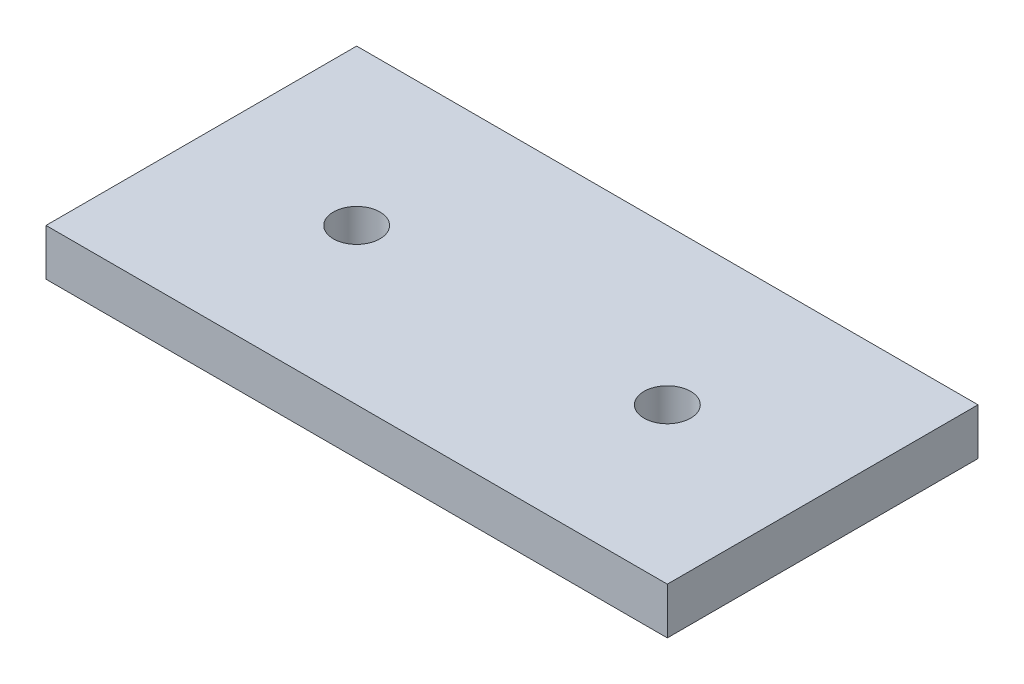
ISO-10303-21;
HEADER;
FILE_DESCRIPTION(('STEP AP214'),'2;1');
FILE_NAME('part.step','',(''),(''),'','','');
FILE_SCHEMA(('AUTOMOTIVE_DESIGN { 1 0 10303 214 1 1 1 1 }'));
ENDSEC;
DATA;
#1=APPLICATION_CONTEXT('core data for automotive mechanical design processes');
#2=APPLICATION_PROTOCOL_DEFINITION('international standard','automotive_design',2000,#1);
#3=PRODUCT_CONTEXT('',#1,'mechanical');
#4=PRODUCT('Part','Part','',(#3));
#5=PRODUCT_RELATED_PRODUCT_CATEGORY('part','',(#4));
#6=PRODUCT_DEFINITION_FORMATION('','',#4);
#7=PRODUCT_DEFINITION_CONTEXT('part definition',#1,'design');
#8=PRODUCT_DEFINITION('design','',#6,#7);
#9=PRODUCT_DEFINITION_SHAPE('','',#8);
#10=(LENGTH_UNIT() NAMED_UNIT(*) SI_UNIT(.MILLI.,.METRE.));
#11=(NAMED_UNIT(*) PLANE_ANGLE_UNIT() SI_UNIT($,.RADIAN.));
#12=(NAMED_UNIT(*) SI_UNIT($,.STERADIAN.) SOLID_ANGLE_UNIT());
#13=UNCERTAINTY_MEASURE_WITH_UNIT(LENGTH_MEASURE(1.E-05),#10,'distance_accuracy_value','');
#14=(GEOMETRIC_REPRESENTATION_CONTEXT(3) GLOBAL_UNCERTAINTY_ASSIGNED_CONTEXT((#13)) GLOBAL_UNIT_ASSIGNED_CONTEXT((#10,
#11,#12)) REPRESENTATION_CONTEXT('',''));
#15=CARTESIAN_POINT('',(0.,0.,0.));
#16=DIRECTION('',(0.,0.,1.));
#17=DIRECTION('',(1.,0.,0.));
#18=AXIS2_PLACEMENT_3D('',#15,#16,#17);
#19=CARTESIAN_POINT('',(0.,3.,0.));
#20=DIRECTION('',(0.,1.,0.));
#21=DIRECTION('',(0.,0.,1.));
#22=AXIS2_PLACEMENT_3D('',#19,#20,#21);
#23=PLANE('',#22);
#24=CARTESIAN_POINT('',(-10.,3.,0.));
#25=DIRECTION('',(0.,1.,0.));
#26=DIRECTION('',(0.,0.,1.));
#27=AXIS2_PLACEMENT_3D('',#24,#25,#26);
#28=CIRCLE('',#27,1.5);
#29=CARTESIAN_POINT('',(-10.,3.,1.5));
#30=VERTEX_POINT('',#29);
#31=EDGE_CURVE('E102',#30,#30,#28,.T.);
#32=ORIENTED_EDGE('',*,*,#31,.F.);
#33=EDGE_LOOP('',(#32));
#34=FACE_BOUND('',#33,.T.);
#35=DIRECTION('',(0.,0.,-1.));
#36=VECTOR('',#35,1.);
#37=CARTESIAN_POINT('',(20.,3.,-10.));
#38=LINE('',#37,#36);
#39=CARTESIAN_POINT('',(20.,3.,10.));
#40=VERTEX_POINT('',#39);
#41=CARTESIAN_POINT('',(20.,3.,-10.));
#42=VERTEX_POINT('',#41);
#43=EDGE_CURVE('E87',#40,#42,#38,.T.);
#44=ORIENTED_EDGE('',*,*,#43,.T.);
#45=DIRECTION('',(-1.,0.,0.));
#46=VECTOR('',#45,1.);
#47=CARTESIAN_POINT('',(-20.,3.,-10.));
#48=LINE('',#47,#46);
#49=CARTESIAN_POINT('',(-20.,3.,-10.));
#50=VERTEX_POINT('',#49);
#51=EDGE_CURVE('E82',#42,#50,#48,.T.);
#52=ORIENTED_EDGE('',*,*,#51,.T.);
#53=DIRECTION('',(0.,0.,1.));
#54=VECTOR('',#53,1.);
#55=CARTESIAN_POINT('',(-20.,3.,-10.));
#56=LINE('',#55,#54);
#57=CARTESIAN_POINT('',(-20.,3.,10.));
#58=VERTEX_POINT('',#57);
#59=EDGE_CURVE('E85',#50,#58,#56,.T.);
#60=ORIENTED_EDGE('',*,*,#59,.T.);
#61=DIRECTION('',(1.,0.,0.));
#62=VECTOR('',#61,1.);
#63=CARTESIAN_POINT('',(-20.,3.,10.));
#64=LINE('',#63,#62);
#65=EDGE_CURVE('E52',#58,#40,#64,.T.);
#66=ORIENTED_EDGE('',*,*,#65,.T.);
#67=EDGE_LOOP('',(#44,#52,#60,#66));
#68=FACE_BOUND('',#67,.T.);
#69=CARTESIAN_POINT('',(10.,3.,0.));
#70=DIRECTION('',(0.,1.,0.));
#71=DIRECTION('',(0.,0.,1.));
#72=AXIS2_PLACEMENT_3D('',#69,#70,#71);
#73=CIRCLE('',#72,1.5);
#74=CARTESIAN_POINT('',(10.,3.,1.5));
#75=VERTEX_POINT('',#74);
#76=EDGE_CURVE('E117',#75,#75,#73,.T.);
#77=ORIENTED_EDGE('',*,*,#76,.F.);
#78=EDGE_LOOP('',(#77));
#79=FACE_BOUND('',#78,.T.);
#80=ADVANCED_FACE('F35',(#34,#68,#79),#23,.T.);
#81=CARTESIAN_POINT('',(0.,0.,0.));
#82=DIRECTION('',(0.,1.,0.));
#83=DIRECTION('',(0.,0.,1.));
#84=AXIS2_PLACEMENT_3D('',#81,#82,#83);
#85=PLANE('',#84);
#86=DIRECTION('',(0.,0.,-1.));
#87=VECTOR('',#86,1.);
#88=CARTESIAN_POINT('',(20.,0.,-10.));
#89=LINE('',#88,#87);
#90=CARTESIAN_POINT('',(20.,0.,10.));
#91=VERTEX_POINT('',#90);
#92=CARTESIAN_POINT('',(20.,0.,-10.));
#93=VERTEX_POINT('',#92);
#94=EDGE_CURVE('E99',#91,#93,#89,.T.);
#95=ORIENTED_EDGE('',*,*,#94,.F.);
#96=DIRECTION('',(1.,0.,0.));
#97=VECTOR('',#96,1.);
#98=CARTESIAN_POINT('',(-20.,0.,10.));
#99=LINE('',#98,#97);
#100=CARTESIAN_POINT('',(-20.,0.,10.));
#101=VERTEX_POINT('',#100);
#102=EDGE_CURVE('E75',#101,#91,#99,.T.);
#103=ORIENTED_EDGE('',*,*,#102,.F.);
#104=DIRECTION('',(0.,0.,1.));
#105=VECTOR('',#104,1.);
#106=CARTESIAN_POINT('',(-20.,0.,-10.));
#107=LINE('',#106,#105);
#108=CARTESIAN_POINT('',(-20.,0.,-10.));
#109=VERTEX_POINT('',#108);
#110=EDGE_CURVE('E69',#109,#101,#107,.T.);
#111=ORIENTED_EDGE('',*,*,#110,.F.);
#112=DIRECTION('',(-1.,0.,0.));
#113=VECTOR('',#112,1.);
#114=CARTESIAN_POINT('',(-20.,0.,-10.));
#115=LINE('',#114,#113);
#116=EDGE_CURVE('E91',#93,#109,#115,.T.);
#117=ORIENTED_EDGE('',*,*,#116,.F.);
#118=EDGE_LOOP('',(#95,#103,#111,#117));
#119=FACE_BOUND('',#118,.T.);
#120=CARTESIAN_POINT('',(-10.,0.,0.));
#121=DIRECTION('',(0.,1.,0.));
#122=DIRECTION('',(0.,0.,1.));
#123=AXIS2_PLACEMENT_3D('',#120,#121,#122);
#124=CIRCLE('',#123,1.5);
#125=CARTESIAN_POINT('',(-10.,0.,1.5));
#126=VERTEX_POINT('',#125);
#127=EDGE_CURVE('E114',#126,#126,#124,.T.);
#128=ORIENTED_EDGE('',*,*,#127,.T.);
#129=EDGE_LOOP('',(#128));
#130=FACE_BOUND('',#129,.T.);
#131=CARTESIAN_POINT('',(10.,0.,0.));
#132=DIRECTION('',(0.,1.,0.));
#133=DIRECTION('',(0.,0.,1.));
#134=AXIS2_PLACEMENT_3D('',#131,#132,#133);
#135=CIRCLE('',#134,1.5);
#136=CARTESIAN_POINT('',(10.,0.,1.5));
#137=VERTEX_POINT('',#136);
#138=EDGE_CURVE('E120',#137,#137,#135,.T.);
#139=ORIENTED_EDGE('',*,*,#138,.T.);
#140=EDGE_LOOP('',(#139));
#141=FACE_BOUND('',#140,.T.);
#142=ADVANCED_FACE('F110',(#119,#130,#141),#85,.F.);
#143=CARTESIAN_POINT('',(20.,3.,-10.));
#144=DIRECTION('',(-1.,0.,0.));
#145=DIRECTION('',(0.,0.,1.));
#146=AXIS2_PLACEMENT_3D('',#143,#144,#145);
#147=PLANE('',#146);
#148=ORIENTED_EDGE('',*,*,#94,.T.);
#149=DIRECTION('',(0.,-1.,0.));
#150=VECTOR('',#149,1.);
#151=CARTESIAN_POINT('',(20.,3.,-10.));
#152=LINE('',#151,#150);
#153=EDGE_CURVE('E11',#42,#93,#152,.T.);
#154=ORIENTED_EDGE('',*,*,#153,.F.);
#155=ORIENTED_EDGE('',*,*,#43,.F.);
#156=DIRECTION('',(0.,-1.,0.));
#157=VECTOR('',#156,1.);
#158=CARTESIAN_POINT('',(20.,3.,10.));
#159=LINE('',#158,#157);
#160=EDGE_CURVE('E95',#40,#91,#159,.T.);
#161=ORIENTED_EDGE('',*,*,#160,.T.);
#162=EDGE_LOOP('',(#148,#154,#155,#161));
#163=FACE_BOUND('',#162,.T.);
#164=ADVANCED_FACE('F37',(#163),#147,.F.);
#165=CARTESIAN_POINT('',(-20.,3.,-10.));
#166=DIRECTION('',(0.,0.,1.));
#167=DIRECTION('',(1.,0.,0.));
#168=AXIS2_PLACEMENT_3D('',#165,#166,#167);
#169=PLANE('',#168);
#170=ORIENTED_EDGE('',*,*,#116,.T.);
#171=DIRECTION('',(0.,-1.,0.));
#172=VECTOR('',#171,1.);
#173=CARTESIAN_POINT('',(-20.,3.,-10.));
#174=LINE('',#173,#172);
#175=EDGE_CURVE('E44',#50,#109,#174,.T.);
#176=ORIENTED_EDGE('',*,*,#175,.F.);
#177=ORIENTED_EDGE('',*,*,#51,.F.);
#178=ORIENTED_EDGE('',*,*,#153,.T.);
#179=EDGE_LOOP('',(#170,#176,#177,#178));
#180=FACE_BOUND('',#179,.T.);
#181=ADVANCED_FACE('F90',(#180),#169,.F.);
#182=CARTESIAN_POINT('',(-20.,3.,-10.));
#183=DIRECTION('',(1.,0.,0.));
#184=DIRECTION('',(0.,0.,-1.));
#185=AXIS2_PLACEMENT_3D('',#182,#183,#184);
#186=PLANE('',#185);
#187=ORIENTED_EDGE('',*,*,#110,.T.);
#188=DIRECTION('',(0.,-1.,0.));
#189=VECTOR('',#188,1.);
#190=CARTESIAN_POINT('',(-20.,3.,10.));
#191=LINE('',#190,#189);
#192=EDGE_CURVE('E92',#58,#101,#191,.T.);
#193=ORIENTED_EDGE('',*,*,#192,.F.);
#194=ORIENTED_EDGE('',*,*,#59,.F.);
#195=ORIENTED_EDGE('',*,*,#175,.T.);
#196=EDGE_LOOP('',(#187,#193,#194,#195));
#197=FACE_BOUND('',#196,.T.);
#198=ADVANCED_FACE('F93',(#197),#186,.F.);
#199=CARTESIAN_POINT('',(-20.,3.,10.));
#200=DIRECTION('',(0.,0.,-1.));
#201=DIRECTION('',(-1.,0.,0.));
#202=AXIS2_PLACEMENT_3D('',#199,#200,#201);
#203=PLANE('',#202);
#204=ORIENTED_EDGE('',*,*,#102,.T.);
#205=ORIENTED_EDGE('',*,*,#160,.F.);
#206=ORIENTED_EDGE('',*,*,#65,.F.);
#207=ORIENTED_EDGE('',*,*,#192,.T.);
#208=EDGE_LOOP('',(#204,#205,#206,#207));
#209=FACE_BOUND('',#208,.T.);
#210=ADVANCED_FACE('F107',(#209),#203,.F.);
#211=CARTESIAN_POINT('',(-10.,3.,0.));
#212=DIRECTION('',(0.,-1.,0.));
#213=DIRECTION('',(0.,0.,-1.));
#214=AXIS2_PLACEMENT_3D('',#211,#212,#213);
#215=CYLINDRICAL_SURFACE('',#214,1.5);
#216=ORIENTED_EDGE('',*,*,#31,.T.);
#217=EDGE_LOOP('',(#216));
#218=FACE_BOUND('',#217,.T.);
#219=ORIENTED_EDGE('',*,*,#127,.F.);
#220=EDGE_LOOP('',(#219));
#221=FACE_BOUND('',#220,.T.);
#222=ADVANCED_FACE('F137',(#218,#221),#215,.F.);
#223=CARTESIAN_POINT('',(10.,3.,0.));
#224=DIRECTION('',(0.,-1.,0.));
#225=DIRECTION('',(0.,0.,-1.));
#226=AXIS2_PLACEMENT_3D('',#223,#224,#225);
#227=CYLINDRICAL_SURFACE('',#226,1.5);
#228=ORIENTED_EDGE('',*,*,#76,.T.);
#229=EDGE_LOOP('',(#228));
#230=FACE_BOUND('',#229,.T.);
#231=ORIENTED_EDGE('',*,*,#138,.F.);
#232=EDGE_LOOP('',(#231));
#233=FACE_BOUND('',#232,.T.);
#234=ADVANCED_FACE('F126',(#230,#233),#227,.F.);
#235=CLOSED_SHELL('',(#80,#142,#164,#181,#198,#210,#222,#234));
#236=MANIFOLD_SOLID_BREP('B2',#235);
#237=ADVANCED_BREP_SHAPE_REPRESENTATION('',(#18,#236),#14);
#238=SHAPE_DEFINITION_REPRESENTATION(#9,#237);
ENDSEC;
END-ISO-10303-21;
